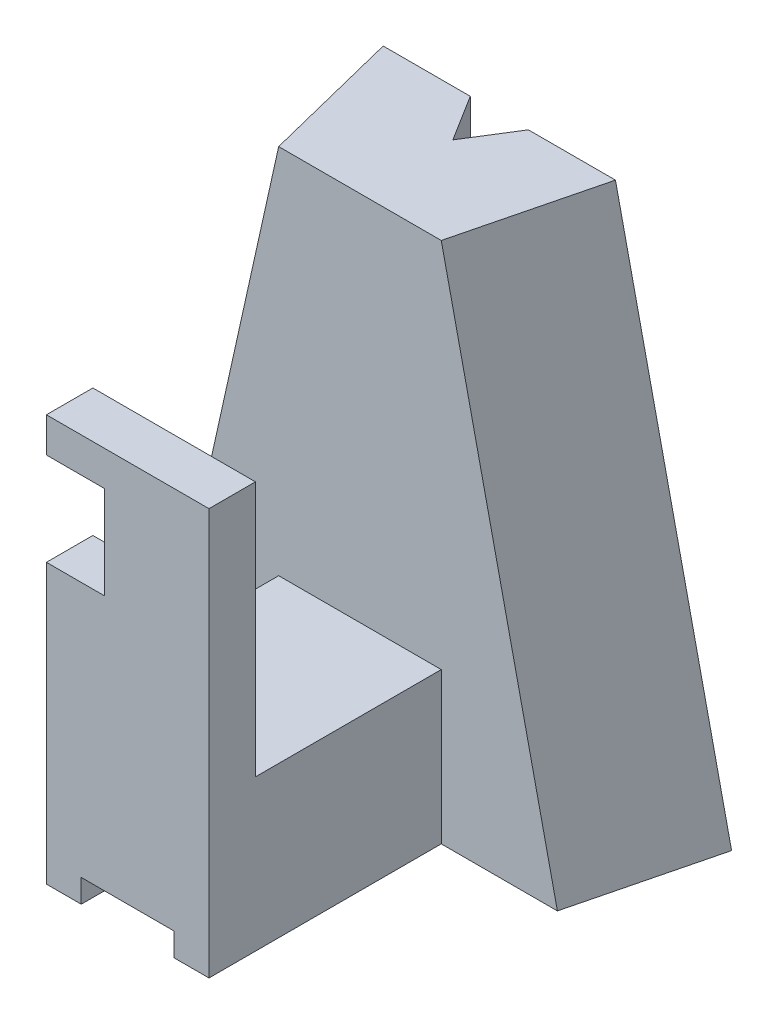
ISO-10303-21;
HEADER;
FILE_DESCRIPTION(('STEP AP214'),'2;1');
FILE_NAME('part.step','',(''),(''),'','','');
FILE_SCHEMA(('AUTOMOTIVE_DESIGN { 1 0 10303 214 1 1 1 1 }'));
ENDSEC;
DATA;
#1=APPLICATION_CONTEXT('core data for automotive mechanical design processes');
#2=APPLICATION_PROTOCOL_DEFINITION('international standard','automotive_design',2000,#1);
#3=PRODUCT_CONTEXT('',#1,'mechanical');
#4=PRODUCT('Part','Part','',(#3));
#5=PRODUCT_RELATED_PRODUCT_CATEGORY('part','',(#4));
#6=PRODUCT_DEFINITION_FORMATION('','',#4);
#7=PRODUCT_DEFINITION_CONTEXT('part definition',#1,'design');
#8=PRODUCT_DEFINITION('design','',#6,#7);
#9=PRODUCT_DEFINITION_SHAPE('','',#8);
#10=(LENGTH_UNIT() NAMED_UNIT(*) SI_UNIT(.MILLI.,.METRE.));
#11=(NAMED_UNIT(*) PLANE_ANGLE_UNIT() SI_UNIT($,.RADIAN.));
#12=(NAMED_UNIT(*) SI_UNIT($,.STERADIAN.) SOLID_ANGLE_UNIT());
#13=UNCERTAINTY_MEASURE_WITH_UNIT(LENGTH_MEASURE(1.E-05),#10,'distance_accuracy_value','');
#14=(GEOMETRIC_REPRESENTATION_CONTEXT(3) GLOBAL_UNCERTAINTY_ASSIGNED_CONTEXT((#13)) GLOBAL_UNIT_ASSIGNED_CONTEXT((#10,
#11,#12)) REPRESENTATION_CONTEXT('',''));
#15=CARTESIAN_POINT('',(0.,0.,0.));
#16=DIRECTION('',(0.,0.,1.));
#17=DIRECTION('',(1.,0.,0.));
#18=AXIS2_PLACEMENT_3D('',#15,#16,#17);
#19=CARTESIAN_POINT('',(-7.,0.,0.));
#20=DIRECTION('',(-1.,0.,0.));
#21=DIRECTION('',(0.,0.,1.));
#22=AXIS2_PLACEMENT_3D('',#19,#20,#21);
#23=PLANE('',#22);
#24=DIRECTION('',(0.,0.,1.));
#25=VECTOR('',#24,1.);
#26=CARTESIAN_POINT('',(-7.,24.,28.));
#27=LINE('',#26,#25);
#28=CARTESIAN_POINT('',(-7.,24.,28.));
#29=VERTEX_POINT('',#28);
#30=CARTESIAN_POINT('',(-7.,24.,32.));
#31=VERTEX_POINT('',#30);
#32=EDGE_CURVE('E224',#29,#31,#27,.T.);
#33=ORIENTED_EDGE('',*,*,#32,.F.);
#34=DIRECTION('',(0.,1.,0.));
#35=VECTOR('',#34,1.);
#36=CARTESIAN_POINT('',(-7.,35.,28.));
#37=LINE('',#36,#35);
#38=CARTESIAN_POINT('',(-7.,13.,28.));
#39=VERTEX_POINT('',#38);
#40=EDGE_CURVE('E302',#39,#29,#37,.T.);
#41=ORIENTED_EDGE('',*,*,#40,.F.);
#42=DIRECTION('',(0.,0.,1.));
#43=VECTOR('',#42,1.);
#44=CARTESIAN_POINT('',(-7.,13.,28.));
#45=LINE('',#44,#43);
#46=CARTESIAN_POINT('',(-7.,13.,12.));
#47=VERTEX_POINT('',#46);
#48=EDGE_CURVE('E297',#47,#39,#45,.T.);
#49=ORIENTED_EDGE('',*,*,#48,.F.);
#50=DIRECTION('',(0.,1.,0.));
#51=VECTOR('',#50,1.);
#52=CARTESIAN_POINT('',(-7.,13.,12.));
#53=LINE('',#52,#51);
#54=CARTESIAN_POINT('',(-7.,0.,12.));
#55=VERTEX_POINT('',#54);
#56=EDGE_CURVE('E301',#55,#47,#53,.T.);
#57=ORIENTED_EDGE('',*,*,#56,.F.);
#58=DIRECTION('',(0.,0.,-1.));
#59=VECTOR('',#58,1.);
#60=CARTESIAN_POINT('',(-7.,0.,12.));
#61=LINE('',#60,#59);
#62=CARTESIAN_POINT('',(-7.,0.,32.));
#63=VERTEX_POINT('',#62);
#64=EDGE_CURVE('E312',#63,#55,#61,.T.);
#65=ORIENTED_EDGE('',*,*,#64,.F.);
#66=DIRECTION('',(0.,-1.,0.));
#67=VECTOR('',#66,1.);
#68=CARTESIAN_POINT('',(-7.,0.,32.));
#69=LINE('',#68,#67);
#70=EDGE_CURVE('E308',#31,#63,#69,.T.);
#71=ORIENTED_EDGE('',*,*,#70,.F.);
#72=EDGE_LOOP('',(#33,#41,#49,#57,#65,#71));
#73=FACE_BOUND('',#72,.T.);
#74=DIRECTION('',(0.,0.,1.));
#75=VECTOR('',#74,1.);
#76=CARTESIAN_POINT('',(-7.,9.,23.));
#77=LINE('',#76,#75);
#78=CARTESIAN_POINT('',(-7.,9.,23.));
#79=VERTEX_POINT('',#78);
#80=CARTESIAN_POINT('',(-7.,9.,28.));
#81=VERTEX_POINT('',#80);
#82=EDGE_CURVE('E219',#79,#81,#77,.T.);
#83=ORIENTED_EDGE('',*,*,#82,.T.);
#84=DIRECTION('',(0.,-1.,0.));
#85=VECTOR('',#84,1.);
#86=CARTESIAN_POINT('',(-7.,4.,28.));
#87=LINE('',#86,#85);
#88=CARTESIAN_POINT('',(-7.,4.,28.));
#89=VERTEX_POINT('',#88);
#90=EDGE_CURVE('E52',#81,#89,#87,.T.);
#91=ORIENTED_EDGE('',*,*,#90,.T.);
#92=DIRECTION('',(0.,0.,-1.));
#93=VECTOR('',#92,1.);
#94=CARTESIAN_POINT('',(-7.,4.,23.));
#95=LINE('',#94,#93);
#96=CARTESIAN_POINT('',(-7.,4.,23.));
#97=VERTEX_POINT('',#96);
#98=EDGE_CURVE('E223',#89,#97,#95,.T.);
#99=ORIENTED_EDGE('',*,*,#98,.T.);
#100=DIRECTION('',(0.,1.,0.));
#101=VECTOR('',#100,1.);
#102=CARTESIAN_POINT('',(-7.,4.,23.));
#103=LINE('',#102,#101);
#104=EDGE_CURVE('E625',#97,#79,#103,.T.);
#105=ORIENTED_EDGE('',*,*,#104,.T.);
#106=EDGE_LOOP('',(#83,#91,#99,#105));
#107=FACE_BOUND('',#106,.T.);
#108=ADVANCED_FACE('F34',(#73,#107),#23,.T.);
#109=DIRECTION('',(0.,0.,-1.));
#110=VECTOR('',#109,1.);
#111=CARTESIAN_POINT('',(-7.,32.,28.));
#112=LINE('',#111,#110);
#113=CARTESIAN_POINT('',(-7.,32.,32.));
#114=VERTEX_POINT('',#113);
#115=CARTESIAN_POINT('',(-7.,32.,28.));
#116=VERTEX_POINT('',#115);
#117=EDGE_CURVE('E227',#114,#116,#112,.T.);
#118=ORIENTED_EDGE('',*,*,#117,.F.);
#119=CARTESIAN_POINT('',(-7.,35.,32.));
#120=VERTEX_POINT('',#119);
#121=EDGE_CURVE('E309',#120,#114,#69,.T.);
#122=ORIENTED_EDGE('',*,*,#121,.F.);
#123=DIRECTION('',(0.,0.,1.));
#124=VECTOR('',#123,1.);
#125=CARTESIAN_POINT('',(-7.,35.,32.));
#126=LINE('',#125,#124);
#127=CARTESIAN_POINT('',(-7.,35.,28.));
#128=VERTEX_POINT('',#127);
#129=EDGE_CURVE('E305',#128,#120,#126,.T.);
#130=ORIENTED_EDGE('',*,*,#129,.F.);
#131=EDGE_CURVE('E300',#116,#128,#37,.T.);
#132=ORIENTED_EDGE('',*,*,#131,.F.);
#133=EDGE_LOOP('',(#118,#122,#130,#132));
#134=FACE_BOUND('',#133,.T.);
#135=ADVANCED_FACE('F449',(#134),#23,.T.);
#136=CARTESIAN_POINT('',(0.,0.,12.));
#137=DIRECTION('',(0.,0.,-1.));
#138=DIRECTION('',(-1.,0.,0.));
#139=AXIS2_PLACEMENT_3D('',#136,#137,#138);
#140=PLANE('',#139);
#141=DIRECTION('',(0.,1.,0.));
#142=VECTOR('',#141,1.);
#143=CARTESIAN_POINT('',(7.,13.,12.));
#144=LINE('',#143,#142);
#145=CARTESIAN_POINT('',(7.,0.,12.));
#146=VERTEX_POINT('',#145);
#147=CARTESIAN_POINT('',(7.,13.,12.));
#148=VERTEX_POINT('',#147);
#149=EDGE_CURVE('E38',#146,#148,#144,.T.);
#150=ORIENTED_EDGE('',*,*,#149,.F.);
#151=DIRECTION('',(1.,0.,0.));
#152=VECTOR('',#151,1.);
#153=CARTESIAN_POINT('',(20.,0.,12.));
#154=LINE('',#153,#152);
#155=CARTESIAN_POINT('',(17.,0.,12.));
#156=VERTEX_POINT('',#155);
#157=EDGE_CURVE('E44',#146,#156,#154,.T.);
#158=ORIENTED_EDGE('',*,*,#157,.T.);
#159=DIRECTION('',(0.216930457818656,-0.976187060183953,0.));
#160=VECTOR('',#159,1.);
#161=CARTESIAN_POINT('',(5.58823529411765,51.3529411764706,12.));
#162=LINE('',#161,#160);
#163=CARTESIAN_POINT('',(7.,45.,12.));
#164=VERTEX_POINT('',#163);
#165=EDGE_CURVE('E347',#164,#156,#162,.T.);
#166=ORIENTED_EDGE('',*,*,#165,.F.);
#167=DIRECTION('',(-1.,0.,0.));
#168=VECTOR('',#167,1.);
#169=CARTESIAN_POINT('',(-10.,45.,12.));
#170=LINE('',#169,#168);
#171=CARTESIAN_POINT('',(-7.,45.,12.));
#172=VERTEX_POINT('',#171);
#173=EDGE_CURVE('E362',#164,#172,#170,.T.);
#174=ORIENTED_EDGE('',*,*,#173,.T.);
#175=DIRECTION('',(-0.216930457818656,-0.976187060183953,0.));
#176=VECTOR('',#175,1.);
#177=CARTESIAN_POINT('',(-5.58823529411765,51.3529411764706,12.));
#178=LINE('',#177,#176);
#179=CARTESIAN_POINT('',(-17.,0.,12.));
#180=VERTEX_POINT('',#179);
#181=EDGE_CURVE('E355',#172,#180,#178,.T.);
#182=ORIENTED_EDGE('',*,*,#181,.T.);
#183=EDGE_CURVE('E11',#180,#55,#154,.T.);
#184=ORIENTED_EDGE('',*,*,#183,.T.);
#185=ORIENTED_EDGE('',*,*,#56,.T.);
#186=DIRECTION('',(1.,0.,0.));
#187=VECTOR('',#186,1.);
#188=CARTESIAN_POINT('',(-7.,13.,12.));
#189=LINE('',#188,#187);
#190=EDGE_CURVE('E324',#47,#148,#189,.T.);
#191=ORIENTED_EDGE('',*,*,#190,.T.);
#192=EDGE_LOOP('',(#150,#158,#166,#174,#182,#184,#185,#191));
#193=FACE_BOUND('',#192,.T.);
#194=ADVANCED_FACE('F418',(#193),#140,.F.);
#195=CARTESIAN_POINT('',(0.,0.,0.));
#196=DIRECTION('',(0.,0.,-1.));
#197=DIRECTION('',(-1.,0.,0.));
#198=AXIS2_PLACEMENT_3D('',#195,#196,#197);
#199=PLANE('',#198);
#200=DIRECTION('',(0.,1.,0.));
#201=VECTOR('',#200,1.);
#202=CARTESIAN_POINT('',(2.5,0.,0.));
#203=LINE('',#202,#201);
#204=CARTESIAN_POINT('',(2.5,0.,0.));
#205=VERTEX_POINT('',#204);
#206=CARTESIAN_POINT('',(2.5,45.,0.));
#207=VERTEX_POINT('',#206);
#208=EDGE_CURVE('E338',#205,#207,#203,.T.);
#209=ORIENTED_EDGE('',*,*,#208,.T.);
#210=DIRECTION('',(-1.,0.,0.));
#211=VECTOR('',#210,1.);
#212=CARTESIAN_POINT('',(-10.,45.,0.));
#213=LINE('',#212,#211);
#214=CARTESIAN_POINT('',(10.,45.,0.));
#215=VERTEX_POINT('',#214);
#216=EDGE_CURVE('E376',#215,#207,#213,.T.);
#217=ORIENTED_EDGE('',*,*,#216,.F.);
#218=DIRECTION('',(-0.216930457818656,0.976187060183953,0.));
#219=VECTOR('',#218,1.);
#220=CARTESIAN_POINT('',(10.,45.,0.));
#221=LINE('',#220,#219);
#222=CARTESIAN_POINT('',(20.,0.,0.));
#223=VERTEX_POINT('',#222);
#224=EDGE_CURVE('E361',#223,#215,#221,.T.);
#225=ORIENTED_EDGE('',*,*,#224,.F.);
#226=DIRECTION('',(1.,0.,0.));
#227=VECTOR('',#226,1.);
#228=CARTESIAN_POINT('',(20.,0.,0.));
#229=LINE('',#228,#227);
#230=EDGE_CURVE('E374',#205,#223,#229,.T.);
#231=ORIENTED_EDGE('',*,*,#230,.F.);
#232=EDGE_LOOP('',(#209,#217,#225,#231));
#233=FACE_BOUND('',#232,.T.);
#234=ADVANCED_FACE('F393',(#233),#199,.T.);
#235=CARTESIAN_POINT('',(-10.,45.,12.));
#236=DIRECTION('',(0.,-1.,0.));
#237=DIRECTION('',(0.,0.,-1.));
#238=AXIS2_PLACEMENT_3D('',#235,#236,#237);
#239=PLANE('',#238);
#240=ORIENTED_EDGE('',*,*,#216,.T.);
#241=DIRECTION('',(0.52999894000318,0.,-0.847998304005088));
#242=VECTOR('',#241,1.);
#243=CARTESIAN_POINT('',(0.,45.,4.));
#244=LINE('',#243,#242);
#245=CARTESIAN_POINT('',(0.,45.,4.));
#246=VERTEX_POINT('',#245);
#247=EDGE_CURVE('E331',#246,#207,#244,.T.);
#248=ORIENTED_EDGE('',*,*,#247,.F.);
#249=DIRECTION('',(0.52999894000318,0.,0.847998304005088));
#250=VECTOR('',#249,1.);
#251=CARTESIAN_POINT('',(-2.5,45.,0.));
#252=LINE('',#251,#250);
#253=CARTESIAN_POINT('',(-2.5,45.,0.));
#254=VERTEX_POINT('',#253);
#255=EDGE_CURVE('E316',#254,#246,#252,.T.);
#256=ORIENTED_EDGE('',*,*,#255,.F.);
#257=CARTESIAN_POINT('',(-10.,45.,0.));
#258=VERTEX_POINT('',#257);
#259=EDGE_CURVE('E378',#254,#258,#213,.T.);
#260=ORIENTED_EDGE('',*,*,#259,.T.);
#261=DIRECTION('',(0.242535625036333,0.,0.970142500145332));
#262=VECTOR('',#261,1.);
#263=CARTESIAN_POINT('',(-7.1764705882353,45.,11.2941176470588));
#264=LINE('',#263,#262);
#265=EDGE_CURVE('E358',#258,#172,#264,.T.);
#266=ORIENTED_EDGE('',*,*,#265,.T.);
#267=ORIENTED_EDGE('',*,*,#173,.F.);
#268=DIRECTION('',(0.242535625036333,0.,-0.970142500145332));
#269=VECTOR('',#268,1.);
#270=CARTESIAN_POINT('',(6.,45.,16.));
#271=LINE('',#270,#269);
#272=EDGE_CURVE('E350',#164,#215,#271,.T.);
#273=ORIENTED_EDGE('',*,*,#272,.T.);
#274=EDGE_LOOP('',(#240,#248,#256,#260,#266,#267,#273));
#275=FACE_BOUND('',#274,.T.);
#276=ADVANCED_FACE('F36',(#275),#239,.F.);
#277=CARTESIAN_POINT('',(20.,0.,12.));
#278=DIRECTION('',(0.,1.,0.));
#279=DIRECTION('',(0.,0.,1.));
#280=AXIS2_PLACEMENT_3D('',#277,#278,#279);
#281=PLANE('',#280);
#282=DIRECTION('',(1.,0.,0.));
#283=VECTOR('',#282,1.);
#284=CARTESIAN_POINT('',(-7.,0.,32.));
#285=LINE('',#284,#283);
#286=CARTESIAN_POINT('',(4.,0.,32.));
#287=VERTEX_POINT('',#286);
#288=CARTESIAN_POINT('',(7.,0.,32.));
#289=VERTEX_POINT('',#288);
#290=EDGE_CURVE('E317',#287,#289,#285,.T.);
#291=ORIENTED_EDGE('',*,*,#290,.F.);
#292=DIRECTION('',(0.,0.,1.));
#293=VECTOR('',#292,1.);
#294=CARTESIAN_POINT('',(4.,0.,27.));
#295=LINE('',#294,#293);
#296=CARTESIAN_POINT('',(4.,0.,27.));
#297=VERTEX_POINT('',#296);
#298=EDGE_CURVE('E274',#297,#287,#295,.T.);
#299=ORIENTED_EDGE('',*,*,#298,.F.);
#300=DIRECTION('',(1.,0.,0.));
#301=VECTOR('',#300,1.);
#302=CARTESIAN_POINT('',(-4.,0.,27.));
#303=LINE('',#302,#301);
#304=CARTESIAN_POINT('',(-4.,0.,27.));
#305=VERTEX_POINT('',#304);
#306=EDGE_CURVE('E265',#305,#297,#303,.T.);
#307=ORIENTED_EDGE('',*,*,#306,.F.);
#308=DIRECTION('',(0.,0.,1.));
#309=VECTOR('',#308,1.);
#310=CARTESIAN_POINT('',(-4.,0.,27.));
#311=LINE('',#310,#309);
#312=CARTESIAN_POINT('',(-4.,0.,32.));
#313=VERTEX_POINT('',#312);
#314=EDGE_CURVE('E276',#305,#313,#311,.T.);
#315=ORIENTED_EDGE('',*,*,#314,.T.);
#316=EDGE_CURVE('E313',#63,#313,#285,.T.);
#317=ORIENTED_EDGE('',*,*,#316,.F.);
#318=ORIENTED_EDGE('',*,*,#64,.T.);
#319=ORIENTED_EDGE('',*,*,#183,.F.);
#320=DIRECTION('',(0.242535625036333,0.,0.970142500145332));
#321=VECTOR('',#320,1.);
#322=CARTESIAN_POINT('',(-17.,0.,12.));
#323=LINE('',#322,#321);
#324=CARTESIAN_POINT('',(-20.,0.,0.));
#325=VERTEX_POINT('',#324);
#326=EDGE_CURVE('E353',#325,#180,#323,.T.);
#327=ORIENTED_EDGE('',*,*,#326,.F.);
#328=CARTESIAN_POINT('',(-2.5,0.,0.));
#329=VERTEX_POINT('',#328);
#330=EDGE_CURVE('E364',#325,#329,#229,.T.);
#331=ORIENTED_EDGE('',*,*,#330,.T.);
#332=DIRECTION('',(0.52999894000318,0.,0.847998304005088));
#333=VECTOR('',#332,1.);
#334=CARTESIAN_POINT('',(-2.5,0.,0.));
#335=LINE('',#334,#333);
#336=CARTESIAN_POINT('',(0.,0.,4.));
#337=VERTEX_POINT('',#336);
#338=EDGE_CURVE('E327',#329,#337,#335,.T.);
#339=ORIENTED_EDGE('',*,*,#338,.T.);
#340=DIRECTION('',(0.52999894000318,0.,-0.847998304005088));
#341=VECTOR('',#340,1.);
#342=CARTESIAN_POINT('',(0.,0.,4.));
#343=LINE('',#342,#341);
#344=EDGE_CURVE('E330',#337,#205,#343,.T.);
#345=ORIENTED_EDGE('',*,*,#344,.T.);
#346=ORIENTED_EDGE('',*,*,#230,.T.);
#347=DIRECTION('',(0.242535625036333,0.,-0.970142500145332));
#348=VECTOR('',#347,1.);
#349=CARTESIAN_POINT('',(17.,0.,12.));
#350=LINE('',#349,#348);
#351=EDGE_CURVE('E341',#156,#223,#350,.T.);
#352=ORIENTED_EDGE('',*,*,#351,.F.);
#353=ORIENTED_EDGE('',*,*,#157,.F.);
#354=DIRECTION('',(0.,0.,-1.));
#355=VECTOR('',#354,1.);
#356=CARTESIAN_POINT('',(7.,0.,12.));
#357=LINE('',#356,#355);
#358=EDGE_CURVE('E296',#289,#146,#357,.T.);
#359=ORIENTED_EDGE('',*,*,#358,.F.);
#360=EDGE_LOOP('',(#291,#299,#307,#315,#317,#318,#319,#327,#331,#339,#345,#346,#352,#353,#359));
#361=FACE_BOUND('',#360,.T.);
#362=ADVANCED_FACE('F399',(#361),#281,.F.);
#363=DIRECTION('',(0.,1.,0.));
#364=VECTOR('',#363,1.);
#365=CARTESIAN_POINT('',(-2.5,0.,0.));
#366=LINE('',#365,#364);
#367=EDGE_CURVE('E334',#329,#254,#366,.T.);
#368=ORIENTED_EDGE('',*,*,#367,.F.);
#369=ORIENTED_EDGE('',*,*,#330,.F.);
#370=DIRECTION('',(-0.216930457818656,-0.976187060183953,0.));
#371=VECTOR('',#370,1.);
#372=CARTESIAN_POINT('',(-10.,45.,0.));
#373=LINE('',#372,#371);
#374=EDGE_CURVE('E375',#258,#325,#373,.T.);
#375=ORIENTED_EDGE('',*,*,#374,.F.);
#376=ORIENTED_EDGE('',*,*,#259,.F.);
#377=EDGE_LOOP('',(#368,#369,#375,#376));
#378=FACE_BOUND('',#377,.T.);
#379=ADVANCED_FACE('F406',(#378),#199,.T.);
#380=CARTESIAN_POINT('',(-5.58823529411765,51.3529411764706,12.));
#381=DIRECTION('',(0.948354065592898,-0.210745347909533,-0.237088516398224));
#382=DIRECTION('',(-0.242535625036333,0.,-0.970142500145332));
#383=AXIS2_PLACEMENT_3D('',#380,#381,#382);
#384=PLANE('',#383);
#385=ORIENTED_EDGE('',*,*,#374,.T.);
#386=ORIENTED_EDGE('',*,*,#326,.T.);
#387=ORIENTED_EDGE('',*,*,#181,.F.);
#388=ORIENTED_EDGE('',*,*,#265,.F.);
#389=EDGE_LOOP('',(#385,#386,#387,#388));
#390=FACE_BOUND('',#389,.T.);
#391=ADVANCED_FACE('F409',(#390),#384,.F.);
#392=CARTESIAN_POINT('',(5.58823529411765,51.3529411764706,12.));
#393=DIRECTION('',(-0.948354065592898,-0.210745347909533,-0.237088516398224));
#394=DIRECTION('',(-0.242535625036333,0.,0.970142500145332));
#395=AXIS2_PLACEMENT_3D('',#392,#393,#394);
#396=PLANE('',#395);
#397=ORIENTED_EDGE('',*,*,#165,.T.);
#398=ORIENTED_EDGE('',*,*,#351,.T.);
#399=ORIENTED_EDGE('',*,*,#224,.T.);
#400=ORIENTED_EDGE('',*,*,#272,.F.);
#401=EDGE_LOOP('',(#397,#398,#399,#400));
#402=FACE_BOUND('',#401,.T.);
#403=ADVANCED_FACE('F387',(#402),#396,.F.);
#404=CARTESIAN_POINT('',(0.,0.,4.));
#405=DIRECTION('',(0.847998304005088,0.,0.52999894000318));
#406=DIRECTION('',(0.52999894000318,0.,-0.847998304005088));
#407=AXIS2_PLACEMENT_3D('',#404,#405,#406);
#408=PLANE('',#407);
#409=ORIENTED_EDGE('',*,*,#247,.T.);
#410=ORIENTED_EDGE('',*,*,#208,.F.);
#411=ORIENTED_EDGE('',*,*,#344,.F.);
#412=DIRECTION('',(0.,1.,0.));
#413=VECTOR('',#412,1.);
#414=CARTESIAN_POINT('',(0.,0.,4.));
#415=LINE('',#414,#413);
#416=EDGE_CURVE('E342',#337,#246,#415,.T.);
#417=ORIENTED_EDGE('',*,*,#416,.T.);
#418=EDGE_LOOP('',(#409,#410,#411,#417));
#419=FACE_BOUND('',#418,.T.);
#420=ADVANCED_FACE('F396',(#419),#408,.F.);
#421=CARTESIAN_POINT('',(-2.5,0.,0.));
#422=DIRECTION('',(-0.847998304005088,0.,0.52999894000318));
#423=DIRECTION('',(0.52999894000318,0.,0.847998304005088));
#424=AXIS2_PLACEMENT_3D('',#421,#422,#423);
#425=PLANE('',#424);
#426=ORIENTED_EDGE('',*,*,#255,.T.);
#427=ORIENTED_EDGE('',*,*,#416,.F.);
#428=ORIENTED_EDGE('',*,*,#338,.F.);
#429=ORIENTED_EDGE('',*,*,#367,.T.);
#430=EDGE_LOOP('',(#426,#427,#428,#429));
#431=FACE_BOUND('',#430,.T.);
#432=ADVANCED_FACE('F404',(#431),#425,.F.);
#433=CARTESIAN_POINT('',(-7.,0.,32.));
#434=DIRECTION('',(0.,0.,1.));
#435=DIRECTION('',(1.,0.,0.));
#436=AXIS2_PLACEMENT_3D('',#433,#434,#435);
#437=PLANE('',#436);
#438=DIRECTION('',(-1.,0.,0.));
#439=VECTOR('',#438,1.);
#440=CARTESIAN_POINT('',(-2.,32.,32.));
#441=LINE('',#440,#439);
#442=CARTESIAN_POINT('',(-2.,32.,32.));
#443=VERTEX_POINT('',#442);
#444=EDGE_CURVE('E249',#443,#114,#441,.T.);
#445=ORIENTED_EDGE('',*,*,#444,.F.);
#446=DIRECTION('',(0.,1.,0.));
#447=VECTOR('',#446,1.);
#448=CARTESIAN_POINT('',(-2.,32.,32.));
#449=LINE('',#448,#447);
#450=CARTESIAN_POINT('',(-2.,24.,32.));
#451=VERTEX_POINT('',#450);
#452=EDGE_CURVE('E239',#451,#443,#449,.T.);
#453=ORIENTED_EDGE('',*,*,#452,.F.);
#454=DIRECTION('',(-1.,0.,0.));
#455=VECTOR('',#454,1.);
#456=CARTESIAN_POINT('',(-2.,24.,32.));
#457=LINE('',#456,#455);
#458=EDGE_CURVE('E251',#451,#31,#457,.T.);
#459=ORIENTED_EDGE('',*,*,#458,.T.);
#460=ORIENTED_EDGE('',*,*,#70,.T.);
#461=ORIENTED_EDGE('',*,*,#316,.T.);
#462=DIRECTION('',(0.,-1.,0.));
#463=VECTOR('',#462,1.);
#464=CARTESIAN_POINT('',(-4.,2.,32.));
#465=LINE('',#464,#463);
#466=CARTESIAN_POINT('',(-4.,2.,32.));
#467=VERTEX_POINT('',#466);
#468=EDGE_CURVE('E259',#467,#313,#465,.T.);
#469=ORIENTED_EDGE('',*,*,#468,.F.);
#470=DIRECTION('',(-1.,0.,0.));
#471=VECTOR('',#470,1.);
#472=CARTESIAN_POINT('',(-4.,2.,32.));
#473=LINE('',#472,#471);
#474=CARTESIAN_POINT('',(4.,2.,32.));
#475=VERTEX_POINT('',#474);
#476=EDGE_CURVE('E270',#475,#467,#473,.T.);
#477=ORIENTED_EDGE('',*,*,#476,.F.);
#478=DIRECTION('',(0.,1.,0.));
#479=VECTOR('',#478,1.);
#480=CARTESIAN_POINT('',(4.,2.,32.));
#481=LINE('',#480,#479);
#482=EDGE_CURVE('E248',#287,#475,#481,.T.);
#483=ORIENTED_EDGE('',*,*,#482,.F.);
#484=ORIENTED_EDGE('',*,*,#290,.T.);
#485=DIRECTION('',(0.,-1.,0.));
#486=VECTOR('',#485,1.);
#487=CARTESIAN_POINT('',(7.,0.,32.));
#488=LINE('',#487,#486);
#489=CARTESIAN_POINT('',(7.,35.,32.));
#490=VERTEX_POINT('',#489);
#491=EDGE_CURVE('E293',#490,#289,#488,.T.);
#492=ORIENTED_EDGE('',*,*,#491,.F.);
#493=DIRECTION('',(1.,0.,0.));
#494=VECTOR('',#493,1.);
#495=CARTESIAN_POINT('',(-7.,35.,32.));
#496=LINE('',#495,#494);
#497=EDGE_CURVE('E318',#120,#490,#496,.T.);
#498=ORIENTED_EDGE('',*,*,#497,.F.);
#499=ORIENTED_EDGE('',*,*,#121,.T.);
#500=EDGE_LOOP('',(#445,#453,#459,#460,#461,#469,#477,#483,#484,#492,#498,#499));
#501=FACE_BOUND('',#500,.T.);
#502=ADVANCED_FACE('F452',(#501),#437,.T.);
#503=CARTESIAN_POINT('',(-7.,35.,32.));
#504=DIRECTION('',(0.,1.,0.));
#505=DIRECTION('',(0.,0.,1.));
#506=AXIS2_PLACEMENT_3D('',#503,#504,#505);
#507=PLANE('',#506);
#508=ORIENTED_EDGE('',*,*,#497,.T.);
#509=DIRECTION('',(0.,0.,1.));
#510=VECTOR('',#509,1.);
#511=CARTESIAN_POINT('',(7.,35.,32.));
#512=LINE('',#511,#510);
#513=CARTESIAN_POINT('',(7.,35.,28.));
#514=VERTEX_POINT('',#513);
#515=EDGE_CURVE('E290',#514,#490,#512,.T.);
#516=ORIENTED_EDGE('',*,*,#515,.F.);
#517=DIRECTION('',(1.,0.,0.));
#518=VECTOR('',#517,1.);
#519=CARTESIAN_POINT('',(-7.,35.,28.));
#520=LINE('',#519,#518);
#521=EDGE_CURVE('E320',#128,#514,#520,.T.);
#522=ORIENTED_EDGE('',*,*,#521,.F.);
#523=ORIENTED_EDGE('',*,*,#129,.T.);
#524=EDGE_LOOP('',(#508,#516,#522,#523));
#525=FACE_BOUND('',#524,.T.);
#526=ADVANCED_FACE('F445',(#525),#507,.T.);
#527=CARTESIAN_POINT('',(-7.,35.,28.));
#528=DIRECTION('',(0.,0.,-1.));
#529=DIRECTION('',(0.,1.,0.));
#530=AXIS2_PLACEMENT_3D('',#527,#528,#529);
#531=PLANE('',#530);
#532=DIRECTION('',(-1.,0.,0.));
#533=VECTOR('',#532,1.);
#534=CARTESIAN_POINT('',(-2.,32.,28.));
#535=LINE('',#534,#533);
#536=CARTESIAN_POINT('',(-2.,32.,28.));
#537=VERTEX_POINT('',#536);
#538=EDGE_CURVE('E245',#537,#116,#535,.T.);
#539=ORIENTED_EDGE('',*,*,#538,.T.);
#540=ORIENTED_EDGE('',*,*,#131,.T.);
#541=ORIENTED_EDGE('',*,*,#521,.T.);
#542=DIRECTION('',(0.,1.,0.));
#543=VECTOR('',#542,1.);
#544=CARTESIAN_POINT('',(7.,35.,28.));
#545=LINE('',#544,#543);
#546=CARTESIAN_POINT('',(7.,13.,28.));
#547=VERTEX_POINT('',#546);
#548=EDGE_CURVE('E287',#547,#514,#545,.T.);
#549=ORIENTED_EDGE('',*,*,#548,.F.);
#550=DIRECTION('',(1.,0.,0.));
#551=VECTOR('',#550,1.);
#552=CARTESIAN_POINT('',(-7.,13.,28.));
#553=LINE('',#552,#551);
#554=EDGE_CURVE('E322',#39,#547,#553,.T.);
#555=ORIENTED_EDGE('',*,*,#554,.F.);
#556=ORIENTED_EDGE('',*,*,#40,.T.);
#557=DIRECTION('',(-1.,0.,0.));
#558=VECTOR('',#557,1.);
#559=CARTESIAN_POINT('',(-2.,24.,28.));
#560=LINE('',#559,#558);
#561=CARTESIAN_POINT('',(-2.,24.,28.));
#562=VERTEX_POINT('',#561);
#563=EDGE_CURVE('E60',#562,#29,#560,.T.);
#564=ORIENTED_EDGE('',*,*,#563,.F.);
#565=DIRECTION('',(0.,-1.,0.));
#566=VECTOR('',#565,1.);
#567=CARTESIAN_POINT('',(-2.,32.,28.));
#568=LINE('',#567,#566);
#569=EDGE_CURVE('E233',#537,#562,#568,.T.);
#570=ORIENTED_EDGE('',*,*,#569,.F.);
#571=EDGE_LOOP('',(#539,#540,#541,#549,#555,#556,#564,#570));
#572=FACE_BOUND('',#571,.T.);
#573=ADVANCED_FACE('F439',(#572),#531,.T.);
#574=CARTESIAN_POINT('',(-7.,13.,28.));
#575=DIRECTION('',(0.,1.,0.));
#576=DIRECTION('',(0.,0.,1.));
#577=AXIS2_PLACEMENT_3D('',#574,#575,#576);
#578=PLANE('',#577);
#579=ORIENTED_EDGE('',*,*,#554,.T.);
#580=DIRECTION('',(0.,0.,1.));
#581=VECTOR('',#580,1.);
#582=CARTESIAN_POINT('',(7.,13.,28.));
#583=LINE('',#582,#581);
#584=EDGE_CURVE('E284',#148,#547,#583,.T.);
#585=ORIENTED_EDGE('',*,*,#584,.F.);
#586=ORIENTED_EDGE('',*,*,#190,.F.);
#587=ORIENTED_EDGE('',*,*,#48,.T.);
#588=EDGE_LOOP('',(#579,#585,#586,#587));
#589=FACE_BOUND('',#588,.T.);
#590=ADVANCED_FACE('F435',(#589),#578,.T.);
#591=CARTESIAN_POINT('',(7.,0.,0.));
#592=DIRECTION('',(-1.,0.,0.));
#593=DIRECTION('',(0.,0.,1.));
#594=AXIS2_PLACEMENT_3D('',#591,#592,#593);
#595=PLANE('',#594);
#596=ORIENTED_EDGE('',*,*,#149,.T.);
#597=ORIENTED_EDGE('',*,*,#584,.T.);
#598=ORIENTED_EDGE('',*,*,#548,.T.);
#599=ORIENTED_EDGE('',*,*,#515,.T.);
#600=ORIENTED_EDGE('',*,*,#491,.T.);
#601=ORIENTED_EDGE('',*,*,#358,.T.);
#602=EDGE_LOOP('',(#596,#597,#598,#599,#600,#601));
#603=FACE_BOUND('',#602,.T.);
#604=ADVANCED_FACE('F431',(#603),#595,.F.);
#605=CARTESIAN_POINT('',(4.,2.,27.));
#606=DIRECTION('',(1.,0.,0.));
#607=DIRECTION('',(0.,1.,0.));
#608=AXIS2_PLACEMENT_3D('',#605,#606,#607);
#609=PLANE('',#608);
#610=ORIENTED_EDGE('',*,*,#482,.T.);
#611=DIRECTION('',(0.,0.,1.));
#612=VECTOR('',#611,1.);
#613=CARTESIAN_POINT('',(4.,2.,27.));
#614=LINE('',#613,#612);
#615=CARTESIAN_POINT('',(4.,2.,27.));
#616=VERTEX_POINT('',#615);
#617=EDGE_CURVE('E268',#616,#475,#614,.T.);
#618=ORIENTED_EDGE('',*,*,#617,.F.);
#619=DIRECTION('',(0.,1.,0.));
#620=VECTOR('',#619,1.);
#621=CARTESIAN_POINT('',(4.,2.,27.));
#622=LINE('',#621,#620);
#623=EDGE_CURVE('E255',#297,#616,#622,.T.);
#624=ORIENTED_EDGE('',*,*,#623,.F.);
#625=ORIENTED_EDGE('',*,*,#298,.T.);
#626=EDGE_LOOP('',(#610,#618,#624,#625));
#627=FACE_BOUND('',#626,.T.);
#628=ADVANCED_FACE('F458',(#627),#609,.F.);
#629=CARTESIAN_POINT('',(-4.,2.,27.));
#630=DIRECTION('',(-1.,0.,0.));
#631=DIRECTION('',(0.,0.,1.));
#632=AXIS2_PLACEMENT_3D('',#629,#630,#631);
#633=PLANE('',#632);
#634=ORIENTED_EDGE('',*,*,#468,.T.);
#635=ORIENTED_EDGE('',*,*,#314,.F.);
#636=DIRECTION('',(0.,-1.,0.));
#637=VECTOR('',#636,1.);
#638=CARTESIAN_POINT('',(-4.,2.,27.));
#639=LINE('',#638,#637);
#640=CARTESIAN_POINT('',(-4.,2.,27.));
#641=VERTEX_POINT('',#640);
#642=EDGE_CURVE('E262',#641,#305,#639,.T.);
#643=ORIENTED_EDGE('',*,*,#642,.F.);
#644=DIRECTION('',(0.,0.,1.));
#645=VECTOR('',#644,1.);
#646=CARTESIAN_POINT('',(-4.,2.,27.));
#647=LINE('',#646,#645);
#648=EDGE_CURVE('E279',#641,#467,#647,.T.);
#649=ORIENTED_EDGE('',*,*,#648,.T.);
#650=EDGE_LOOP('',(#634,#635,#643,#649));
#651=FACE_BOUND('',#650,.T.);
#652=ADVANCED_FACE('F648',(#651),#633,.F.);
#653=CARTESIAN_POINT('',(-4.,2.,27.));
#654=DIRECTION('',(0.,1.,0.));
#655=DIRECTION('',(0.,0.,1.));
#656=AXIS2_PLACEMENT_3D('',#653,#654,#655);
#657=PLANE('',#656);
#658=ORIENTED_EDGE('',*,*,#476,.T.);
#659=ORIENTED_EDGE('',*,*,#648,.F.);
#660=DIRECTION('',(-1.,0.,0.));
#661=VECTOR('',#660,1.);
#662=CARTESIAN_POINT('',(-4.,2.,27.));
#663=LINE('',#662,#661);
#664=EDGE_CURVE('E258',#616,#641,#663,.T.);
#665=ORIENTED_EDGE('',*,*,#664,.F.);
#666=ORIENTED_EDGE('',*,*,#617,.T.);
#667=EDGE_LOOP('',(#658,#659,#665,#666));
#668=FACE_BOUND('',#667,.T.);
#669=ADVANCED_FACE('F461',(#668),#657,.F.);
#670=CARTESIAN_POINT('',(0.,0.,27.));
#671=DIRECTION('',(0.,0.,1.));
#672=DIRECTION('',(1.,0.,0.));
#673=AXIS2_PLACEMENT_3D('',#670,#671,#672);
#674=PLANE('',#673);
#675=ORIENTED_EDGE('',*,*,#623,.T.);
#676=ORIENTED_EDGE('',*,*,#664,.T.);
#677=ORIENTED_EDGE('',*,*,#642,.T.);
#678=ORIENTED_EDGE('',*,*,#306,.T.);
#679=EDGE_LOOP('',(#675,#676,#677,#678));
#680=FACE_BOUND('',#679,.T.);
#681=ADVANCED_FACE('F464',(#680),#674,.T.);
#682=CARTESIAN_POINT('',(-2.,32.,28.));
#683=DIRECTION('',(0.,1.,0.));
#684=DIRECTION('',(0.,0.,1.));
#685=AXIS2_PLACEMENT_3D('',#682,#683,#684);
#686=PLANE('',#685);
#687=ORIENTED_EDGE('',*,*,#117,.T.);
#688=ORIENTED_EDGE('',*,*,#538,.F.);
#689=DIRECTION('',(0.,0.,-1.));
#690=VECTOR('',#689,1.);
#691=CARTESIAN_POINT('',(-2.,32.,28.));
#692=LINE('',#691,#690);
#693=EDGE_CURVE('E241',#443,#537,#692,.T.);
#694=ORIENTED_EDGE('',*,*,#693,.F.);
#695=ORIENTED_EDGE('',*,*,#444,.T.);
#696=EDGE_LOOP('',(#687,#688,#694,#695));
#697=FACE_BOUND('',#696,.T.);
#698=ADVANCED_FACE('F475',(#697),#686,.F.);
#699=CARTESIAN_POINT('',(-2.,24.,28.));
#700=DIRECTION('',(0.,-1.,0.));
#701=DIRECTION('',(0.,0.,-1.));
#702=AXIS2_PLACEMENT_3D('',#699,#700,#701);
#703=PLANE('',#702);
#704=ORIENTED_EDGE('',*,*,#32,.T.);
#705=ORIENTED_EDGE('',*,*,#458,.F.);
#706=DIRECTION('',(0.,0.,1.));
#707=VECTOR('',#706,1.);
#708=CARTESIAN_POINT('',(-2.,24.,28.));
#709=LINE('',#708,#707);
#710=EDGE_CURVE('E236',#562,#451,#709,.T.);
#711=ORIENTED_EDGE('',*,*,#710,.F.);
#712=ORIENTED_EDGE('',*,*,#563,.T.);
#713=EDGE_LOOP('',(#704,#705,#711,#712));
#714=FACE_BOUND('',#713,.T.);
#715=ADVANCED_FACE('F477',(#714),#703,.F.);
#716=CARTESIAN_POINT('',(-2.,0.,0.));
#717=DIRECTION('',(-1.,0.,0.));
#718=DIRECTION('',(0.,0.,1.));
#719=AXIS2_PLACEMENT_3D('',#716,#717,#718);
#720=PLANE('',#719);
#721=ORIENTED_EDGE('',*,*,#569,.T.);
#722=ORIENTED_EDGE('',*,*,#710,.T.);
#723=ORIENTED_EDGE('',*,*,#452,.T.);
#724=ORIENTED_EDGE('',*,*,#693,.T.);
#725=EDGE_LOOP('',(#721,#722,#723,#724));
#726=FACE_BOUND('',#725,.T.);
#727=ADVANCED_FACE('F472',(#726),#720,.T.);
#728=CARTESIAN_POINT('',(-5.,4.,28.));
#729=DIRECTION('',(0.,0.,-1.));
#730=DIRECTION('',(-1.,0.,0.));
#731=AXIS2_PLACEMENT_3D('',#728,#729,#730);
#732=PLANE('',#731);
#733=ORIENTED_EDGE('',*,*,#90,.F.);
#734=DIRECTION('',(-1.,0.,0.));
#735=VECTOR('',#734,1.);
#736=CARTESIAN_POINT('',(-5.,9.,28.));
#737=LINE('',#736,#735);
#738=CARTESIAN_POINT('',(-5.,9.,28.));
#739=VERTEX_POINT('',#738);
#740=EDGE_CURVE('E218',#739,#81,#737,.T.);
#741=ORIENTED_EDGE('',*,*,#740,.F.);
#742=DIRECTION('',(0.,-1.,0.));
#743=VECTOR('',#742,1.);
#744=CARTESIAN_POINT('',(-5.,4.,28.));
#745=LINE('',#744,#743);
#746=CARTESIAN_POINT('',(-5.,4.,28.));
#747=VERTEX_POINT('',#746);
#748=EDGE_CURVE('E210',#739,#747,#745,.T.);
#749=ORIENTED_EDGE('',*,*,#748,.T.);
#750=DIRECTION('',(-1.,0.,0.));
#751=VECTOR('',#750,1.);
#752=CARTESIAN_POINT('',(-5.,4.,28.));
#753=LINE('',#752,#751);
#754=EDGE_CURVE('E217',#747,#89,#753,.T.);
#755=ORIENTED_EDGE('',*,*,#754,.T.);
#756=EDGE_LOOP('',(#733,#741,#749,#755));
#757=FACE_BOUND('',#756,.T.);
#758=ADVANCED_FACE('F216',(#757),#732,.T.);
#759=CARTESIAN_POINT('',(-5.,4.,23.));
#760=DIRECTION('',(0.,1.,0.));
#761=DIRECTION('',(0.,0.,1.));
#762=AXIS2_PLACEMENT_3D('',#759,#760,#761);
#763=PLANE('',#762);
#764=ORIENTED_EDGE('',*,*,#98,.F.);
#765=ORIENTED_EDGE('',*,*,#754,.F.);
#766=DIRECTION('',(0.,0.,-1.));
#767=VECTOR('',#766,1.);
#768=CARTESIAN_POINT('',(-5.,4.,23.));
#769=LINE('',#768,#767);
#770=CARTESIAN_POINT('',(-5.,4.,23.));
#771=VERTEX_POINT('',#770);
#772=EDGE_CURVE('E206',#747,#771,#769,.T.);
#773=ORIENTED_EDGE('',*,*,#772,.T.);
#774=DIRECTION('',(-1.,0.,0.));
#775=VECTOR('',#774,1.);
#776=CARTESIAN_POINT('',(-5.,4.,23.));
#777=LINE('',#776,#775);
#778=EDGE_CURVE('E225',#771,#97,#777,.T.);
#779=ORIENTED_EDGE('',*,*,#778,.T.);
#780=EDGE_LOOP('',(#764,#765,#773,#779));
#781=FACE_BOUND('',#780,.T.);
#782=ADVANCED_FACE('F221',(#781),#763,.T.);
#783=CARTESIAN_POINT('',(-5.,4.,23.));
#784=DIRECTION('',(0.,0.,1.));
#785=DIRECTION('',(1.,0.,0.));
#786=AXIS2_PLACEMENT_3D('',#783,#784,#785);
#787=PLANE('',#786);
#788=ORIENTED_EDGE('',*,*,#104,.F.);
#789=ORIENTED_EDGE('',*,*,#778,.F.);
#790=DIRECTION('',(0.,1.,0.));
#791=VECTOR('',#790,1.);
#792=CARTESIAN_POINT('',(-5.,4.,23.));
#793=LINE('',#792,#791);
#794=CARTESIAN_POINT('',(-5.,9.,23.));
#795=VERTEX_POINT('',#794);
#796=EDGE_CURVE('E211',#771,#795,#793,.T.);
#797=ORIENTED_EDGE('',*,*,#796,.T.);
#798=DIRECTION('',(-1.,0.,0.));
#799=VECTOR('',#798,1.);
#800=CARTESIAN_POINT('',(-5.,9.,23.));
#801=LINE('',#800,#799);
#802=EDGE_CURVE('E229',#795,#79,#801,.T.);
#803=ORIENTED_EDGE('',*,*,#802,.T.);
#804=EDGE_LOOP('',(#788,#789,#797,#803));
#805=FACE_BOUND('',#804,.T.);
#806=ADVANCED_FACE('F590',(#805),#787,.T.);
#807=CARTESIAN_POINT('',(-5.,9.,23.));
#808=DIRECTION('',(0.,-1.,0.));
#809=DIRECTION('',(0.,0.,-1.));
#810=AXIS2_PLACEMENT_3D('',#807,#808,#809);
#811=PLANE('',#810);
#812=ORIENTED_EDGE('',*,*,#82,.F.);
#813=ORIENTED_EDGE('',*,*,#802,.F.);
#814=DIRECTION('',(0.,0.,1.));
#815=VECTOR('',#814,1.);
#816=CARTESIAN_POINT('',(-5.,9.,23.));
#817=LINE('',#816,#815);
#818=EDGE_CURVE('E632',#795,#739,#817,.T.);
#819=ORIENTED_EDGE('',*,*,#818,.T.);
#820=ORIENTED_EDGE('',*,*,#740,.T.);
#821=EDGE_LOOP('',(#812,#813,#819,#820));
#822=FACE_BOUND('',#821,.T.);
#823=ADVANCED_FACE('F599',(#822),#811,.T.);
#824=CARTESIAN_POINT('',(-5.,0.,0.));
#825=DIRECTION('',(1.,0.,0.));
#826=DIRECTION('',(0.,0.,-1.));
#827=AXIS2_PLACEMENT_3D('',#824,#825,#826);
#828=PLANE('',#827);
#829=ORIENTED_EDGE('',*,*,#748,.F.);
#830=ORIENTED_EDGE('',*,*,#818,.F.);
#831=ORIENTED_EDGE('',*,*,#796,.F.);
#832=ORIENTED_EDGE('',*,*,#772,.F.);
#833=EDGE_LOOP('',(#829,#830,#831,#832));
#834=FACE_BOUND('',#833,.T.);
#835=ADVANCED_FACE('F208',(#834),#828,.F.);
#836=CLOSED_SHELL('',(#108,#135,#194,#234,#276,#362,#379,#391,#403,#420,#432,#502,#526,#573,
#590,#604,#628,#652,#669,#681,#698,#715,#727,#758,#782,#806,#823,#835));
#837=MANIFOLD_SOLID_BREP('B2',#836);
#838=ADVANCED_BREP_SHAPE_REPRESENTATION('',(#18,#837),#14);
#839=SHAPE_DEFINITION_REPRESENTATION(#9,#838);
ENDSEC;
END-ISO-10303-21;
